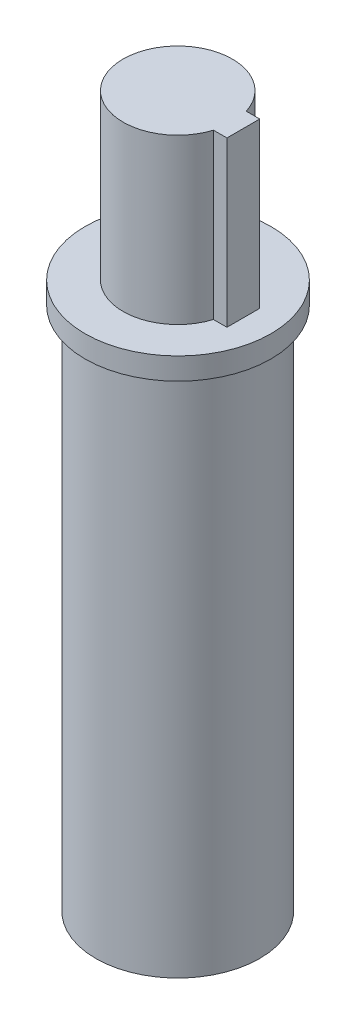
ISO-10303-21;
HEADER;
FILE_DESCRIPTION(('STEP AP214'),'2;1');
FILE_NAME('part.step','',(''),(''),'','','');
FILE_SCHEMA(('AUTOMOTIVE_DESIGN { 1 0 10303 214 1 1 1 1 }'));
ENDSEC;
DATA;
#1=APPLICATION_CONTEXT('core data for automotive mechanical design processes');
#2=APPLICATION_PROTOCOL_DEFINITION('international standard','automotive_design',2000,#1);
#3=PRODUCT_CONTEXT('',#1,'mechanical');
#4=PRODUCT('Part','Part','',(#3));
#5=PRODUCT_RELATED_PRODUCT_CATEGORY('part','',(#4));
#6=PRODUCT_DEFINITION_FORMATION('','',#4);
#7=PRODUCT_DEFINITION_CONTEXT('part definition',#1,'design');
#8=PRODUCT_DEFINITION('design','',#6,#7);
#9=PRODUCT_DEFINITION_SHAPE('','',#8);
#10=(LENGTH_UNIT() NAMED_UNIT(*) SI_UNIT(.MILLI.,.METRE.));
#11=(NAMED_UNIT(*) PLANE_ANGLE_UNIT() SI_UNIT($,.RADIAN.));
#12=(NAMED_UNIT(*) SI_UNIT($,.STERADIAN.) SOLID_ANGLE_UNIT());
#13=UNCERTAINTY_MEASURE_WITH_UNIT(LENGTH_MEASURE(1.E-05),#10,'distance_accuracy_value','');
#14=(GEOMETRIC_REPRESENTATION_CONTEXT(3) GLOBAL_UNCERTAINTY_ASSIGNED_CONTEXT((#13)) GLOBAL_UNIT_ASSIGNED_CONTEXT((#10,
#11,#12)) REPRESENTATION_CONTEXT('',''));
#15=CARTESIAN_POINT('',(0.,0.,0.));
#16=DIRECTION('',(0.,0.,1.));
#17=DIRECTION('',(1.,0.,0.));
#18=AXIS2_PLACEMENT_3D('',#15,#16,#17);
#19=CARTESIAN_POINT('',(47.4604945375291,339.346249199291,-15.));
#20=DIRECTION('',(0.,0.,-1.));
#21=DIRECTION('',(-1.,0.,0.));
#22=AXIS2_PLACEMENT_3D('',#19,#20,#21);
#23=PLANE('',#22);
#24=DIRECTION('',(1.,0.,0.));
#25=VECTOR('',#24,1.);
#26=CARTESIAN_POINT('',(47.4604945375291,189.346249199291,-15.));
#27=LINE('',#26,#25);
#28=CARTESIAN_POINT('',(47.4604945375291,189.346249199291,-15.));
#29=VERTEX_POINT('',#28);
#30=CARTESIAN_POINT('',(59.7635344666819,189.346249199291,-15.));
#31=VERTEX_POINT('',#30);
#32=EDGE_CURVE('E81',#29,#31,#27,.T.);
#33=ORIENTED_EDGE('',*,*,#32,.F.);
#34=DIRECTION('',(0.,-1.,0.));
#35=VECTOR('',#34,1.);
#36=CARTESIAN_POINT('',(47.4604945375291,339.346249199291,-15.));
#37=LINE('',#36,#35);
#38=CARTESIAN_POINT('',(47.4604945375291,339.346249199291,-15.));
#39=VERTEX_POINT('',#38);
#40=EDGE_CURVE('E50',#39,#29,#37,.T.);
#41=ORIENTED_EDGE('',*,*,#40,.F.);
#42=DIRECTION('',(1.,0.,0.));
#43=VECTOR('',#42,1.);
#44=CARTESIAN_POINT('',(47.4604945375291,339.346249199291,-15.));
#45=LINE('',#44,#43);
#46=CARTESIAN_POINT('',(59.7635344666819,339.346249199291,-15.));
#47=VERTEX_POINT('',#46);
#48=EDGE_CURVE('E88',#39,#47,#45,.T.);
#49=ORIENTED_EDGE('',*,*,#48,.T.);
#50=DIRECTION('',(0.,-1.,0.));
#51=VECTOR('',#50,1.);
#52=CARTESIAN_POINT('',(59.7635344666819,339.346249199291,-15.));
#53=LINE('',#52,#51);
#54=EDGE_CURVE('E96',#47,#31,#53,.T.);
#55=ORIENTED_EDGE('',*,*,#54,.T.);
#56=EDGE_LOOP('',(#33,#41,#49,#55));
#57=FACE_BOUND('',#56,.T.);
#58=ADVANCED_FACE('F42',(#57),#23,.T.);
#59=CARTESIAN_POINT('',(-0.236465533318149,339.346249199291,0.));
#60=DIRECTION('',(0.,-1.,0.));
#61=DIRECTION('',(0.,0.,-1.));
#62=AXIS2_PLACEMENT_3D('',#59,#60,#61);
#63=CYLINDRICAL_SURFACE('',#62,50.);
#64=CARTESIAN_POINT('',(-0.236465533318149,189.346249199291,0.));
#65=DIRECTION('',(0.,1.,0.));
#66=DIRECTION('',(0.,0.,1.));
#67=AXIS2_PLACEMENT_3D('',#64,#65,#66);
#68=CIRCLE('',#67,50.);
#69=CARTESIAN_POINT('',(47.4604945375291,189.346249199291,15.));
#70=VERTEX_POINT('',#69);
#71=EDGE_CURVE('E78',#29,#70,#68,.T.);
#72=ORIENTED_EDGE('',*,*,#71,.T.);
#73=DIRECTION('',(0.,-1.,0.));
#74=VECTOR('',#73,1.);
#75=CARTESIAN_POINT('',(47.4604945375291,339.346249199291,15.));
#76=LINE('',#75,#74);
#77=CARTESIAN_POINT('',(47.4604945375291,339.346249199291,15.));
#78=VERTEX_POINT('',#77);
#79=EDGE_CURVE('E93',#78,#70,#76,.T.);
#80=ORIENTED_EDGE('',*,*,#79,.F.);
#81=CARTESIAN_POINT('',(-0.236465533318149,339.346249199291,0.));
#82=DIRECTION('',(0.,1.,0.));
#83=DIRECTION('',(0.,0.,1.));
#84=AXIS2_PLACEMENT_3D('',#81,#82,#83);
#85=CIRCLE('',#84,50.);
#86=EDGE_CURVE('E91',#39,#78,#85,.T.);
#87=ORIENTED_EDGE('',*,*,#86,.F.);
#88=ORIENTED_EDGE('',*,*,#40,.T.);
#89=EDGE_LOOP('',(#72,#80,#87,#88));
#90=FACE_BOUND('',#89,.T.);
#91=ADVANCED_FACE('F90',(#90),#63,.T.);
#92=CARTESIAN_POINT('',(47.4604945375291,339.346249199291,15.));
#93=DIRECTION('',(0.,0.,-1.));
#94=DIRECTION('',(-1.,0.,0.));
#95=AXIS2_PLACEMENT_3D('',#92,#93,#94);
#96=PLANE('',#95);
#97=DIRECTION('',(1.,0.,0.));
#98=VECTOR('',#97,1.);
#99=CARTESIAN_POINT('',(47.4604945375291,189.346249199291,15.));
#100=LINE('',#99,#98);
#101=CARTESIAN_POINT('',(59.7635344666819,189.346249199291,15.));
#102=VERTEX_POINT('',#101);
#103=EDGE_CURVE('E84',#70,#102,#100,.T.);
#104=ORIENTED_EDGE('',*,*,#103,.T.);
#105=DIRECTION('',(0.,-1.,0.));
#106=VECTOR('',#105,1.);
#107=CARTESIAN_POINT('',(59.7635344666819,339.346249199291,15.));
#108=LINE('',#107,#106);
#109=CARTESIAN_POINT('',(59.7635344666819,339.346249199291,15.));
#110=VERTEX_POINT('',#109);
#111=EDGE_CURVE('E110',#110,#102,#108,.T.);
#112=ORIENTED_EDGE('',*,*,#111,.F.);
#113=DIRECTION('',(1.,0.,0.));
#114=VECTOR('',#113,1.);
#115=CARTESIAN_POINT('',(47.4604945375291,339.346249199291,15.));
#116=LINE('',#115,#114);
#117=EDGE_CURVE('E112',#78,#110,#116,.T.);
#118=ORIENTED_EDGE('',*,*,#117,.F.);
#119=ORIENTED_EDGE('',*,*,#79,.T.);
#120=EDGE_LOOP('',(#104,#112,#118,#119));
#121=FACE_BOUND('',#120,.T.);
#122=ADVANCED_FACE('F147',(#121),#96,.F.);
#123=CARTESIAN_POINT('',(59.7635344666819,339.346249199291,15.));
#124=DIRECTION('',(-1.,0.,0.));
#125=DIRECTION('',(0.,0.,1.));
#126=AXIS2_PLACEMENT_3D('',#123,#124,#125);
#127=PLANE('',#126);
#128=DIRECTION('',(0.,0.,-1.));
#129=VECTOR('',#128,1.);
#130=CARTESIAN_POINT('',(59.7635344666819,189.346249199291,15.));
#131=LINE('',#130,#129);
#132=EDGE_CURVE('E98',#102,#31,#131,.T.);
#133=ORIENTED_EDGE('',*,*,#132,.T.);
#134=ORIENTED_EDGE('',*,*,#54,.F.);
#135=DIRECTION('',(0.,0.,-1.));
#136=VECTOR('',#135,1.);
#137=CARTESIAN_POINT('',(59.7635344666819,339.346249199291,15.));
#138=LINE('',#137,#136);
#139=EDGE_CURVE('E114',#110,#47,#138,.T.);
#140=ORIENTED_EDGE('',*,*,#139,.F.);
#141=ORIENTED_EDGE('',*,*,#111,.T.);
#142=EDGE_LOOP('',(#133,#134,#140,#141));
#143=FACE_BOUND('',#142,.T.);
#144=ADVANCED_FACE('F152',(#143),#127,.F.);
#145=CARTESIAN_POINT('',(-0.236465533318149,339.346249199291,0.));
#146=DIRECTION('',(0.,1.,0.));
#147=DIRECTION('',(0.,0.,1.));
#148=AXIS2_PLACEMENT_3D('',#145,#146,#147);
#149=PLANE('',#148);
#150=ORIENTED_EDGE('',*,*,#48,.F.);
#151=ORIENTED_EDGE('',*,*,#86,.T.);
#152=ORIENTED_EDGE('',*,*,#117,.T.);
#153=ORIENTED_EDGE('',*,*,#139,.T.);
#154=EDGE_LOOP('',(#150,#151,#152,#153));
#155=FACE_BOUND('',#154,.T.);
#156=ADVANCED_FACE('F156',(#155),#149,.T.);
#157=CARTESIAN_POINT('',(-0.236465533318149,189.346249199291,0.));
#158=DIRECTION('',(0.,-1.,0.));
#159=DIRECTION('',(0.,0.,-1.));
#160=AXIS2_PLACEMENT_3D('',#157,#158,#159);
#161=PLANE('',#160);
#162=ORIENTED_EDGE('',*,*,#71,.F.);
#163=ORIENTED_EDGE('',*,*,#32,.T.);
#164=ORIENTED_EDGE('',*,*,#132,.F.);
#165=ORIENTED_EDGE('',*,*,#103,.F.);
#166=EDGE_LOOP('',(#162,#163,#164,#165));
#167=FACE_BOUND('',#166,.T.);
#168=CARTESIAN_POINT('',(0.,189.346249199291,0.));
#169=DIRECTION('',(0.,1.,0.));
#170=DIRECTION('',(0.,0.,1.));
#171=AXIS2_PLACEMENT_3D('',#168,#169,#170);
#172=CIRCLE('',#171,85.);
#173=CARTESIAN_POINT('',(0.,189.346249199291,85.));
#174=VERTEX_POINT('',#173);
#175=EDGE_CURVE('E120',#174,#174,#172,.T.);
#176=ORIENTED_EDGE('',*,*,#175,.T.);
#177=EDGE_LOOP('',(#176));
#178=FACE_BOUND('',#177,.T.);
#179=ADVANCED_FACE('F79',(#167,#178),#161,.F.);
#180=CARTESIAN_POINT('',(0.,169.346249199291,0.));
#181=DIRECTION('',(0.,1.,0.));
#182=DIRECTION('',(0.,0.,1.));
#183=AXIS2_PLACEMENT_3D('',#180,#181,#182);
#184=CYLINDRICAL_SURFACE('',#183,85.);
#185=CARTESIAN_POINT('',(0.,169.346249199291,0.));
#186=DIRECTION('',(0.,1.,0.));
#187=DIRECTION('',(0.,0.,1.));
#188=AXIS2_PLACEMENT_3D('',#185,#186,#187);
#189=CIRCLE('',#188,85.);
#190=CARTESIAN_POINT('',(0.,169.346249199291,85.));
#191=VERTEX_POINT('',#190);
#192=EDGE_CURVE('E103',#191,#191,#189,.T.);
#193=ORIENTED_EDGE('',*,*,#192,.T.);
#194=EDGE_LOOP('',(#193));
#195=FACE_BOUND('',#194,.T.);
#196=ORIENTED_EDGE('',*,*,#175,.F.);
#197=EDGE_LOOP('',(#196));
#198=FACE_BOUND('',#197,.T.);
#199=ADVANCED_FACE('F126',(#195,#198),#184,.T.);
#200=CARTESIAN_POINT('',(0.,169.346249199291,0.));
#201=DIRECTION('',(0.,1.,0.));
#202=DIRECTION('',(0.,0.,1.));
#203=AXIS2_PLACEMENT_3D('',#200,#201,#202);
#204=PLANE('',#203);
#205=CARTESIAN_POINT('',(-0.236465533318149,169.346249199291,0.));
#206=DIRECTION('',(0.,1.,0.));
#207=DIRECTION('',(0.,0.,1.));
#208=AXIS2_PLACEMENT_3D('',#205,#206,#207);
#209=CIRCLE('',#208,75.);
#210=CARTESIAN_POINT('',(-0.236465533318149,169.346249199291,75.));
#211=VERTEX_POINT('',#210);
#212=EDGE_CURVE('E12',#211,#211,#209,.T.);
#213=ORIENTED_EDGE('',*,*,#212,.T.);
#214=EDGE_LOOP('',(#213));
#215=FACE_BOUND('',#214,.T.);
#216=ORIENTED_EDGE('',*,*,#192,.F.);
#217=EDGE_LOOP('',(#216));
#218=FACE_BOUND('',#217,.T.);
#219=ADVANCED_FACE('F129',(#215,#218),#204,.F.);
#220=CARTESIAN_POINT('',(-0.236465533318149,-310.653750800709,0.));
#221=DIRECTION('',(0.,-1.,0.));
#222=DIRECTION('',(0.,0.,-1.));
#223=AXIS2_PLACEMENT_3D('',#220,#221,#222);
#224=PLANE('',#223);
#225=CARTESIAN_POINT('',(-0.236465533318149,-310.653750800709,0.));
#226=DIRECTION('',(0.,-1.,0.));
#227=DIRECTION('',(0.,0.,-1.));
#228=AXIS2_PLACEMENT_3D('',#225,#226,#227);
#229=CIRCLE('',#228,75.);
#230=CARTESIAN_POINT('',(-0.236465533318149,-310.653750800709,-75.));
#231=VERTEX_POINT('',#230);
#232=EDGE_CURVE('E99',#231,#231,#229,.T.);
#233=ORIENTED_EDGE('',*,*,#232,.T.);
#234=EDGE_LOOP('',(#233));
#235=FACE_BOUND('',#234,.T.);
#236=ADVANCED_FACE('F131',(#235),#224,.T.);
#237=CARTESIAN_POINT('',(-0.236465533318149,-310.653750800709,0.));
#238=DIRECTION('',(0.,1.,0.));
#239=DIRECTION('',(0.,0.,1.));
#240=AXIS2_PLACEMENT_3D('',#237,#238,#239);
#241=CYLINDRICAL_SURFACE('',#240,75.);
#242=ORIENTED_EDGE('',*,*,#232,.F.);
#243=EDGE_LOOP('',(#242));
#244=FACE_BOUND('',#243,.T.);
#245=ORIENTED_EDGE('',*,*,#212,.F.);
#246=EDGE_LOOP('',(#245));
#247=FACE_BOUND('',#246,.T.);
#248=ADVANCED_FACE('F139',(#244,#247),#241,.T.);
#249=CLOSED_SHELL('',(#58,#91,#122,#144,#156,#179,#199,#219,#236,#248));
#250=MANIFOLD_SOLID_BREP('B2',#249);
#251=ADVANCED_BREP_SHAPE_REPRESENTATION('',(#18,#250),#14);
#252=SHAPE_DEFINITION_REPRESENTATION(#9,#251);
ENDSEC;
END-ISO-10303-21;
